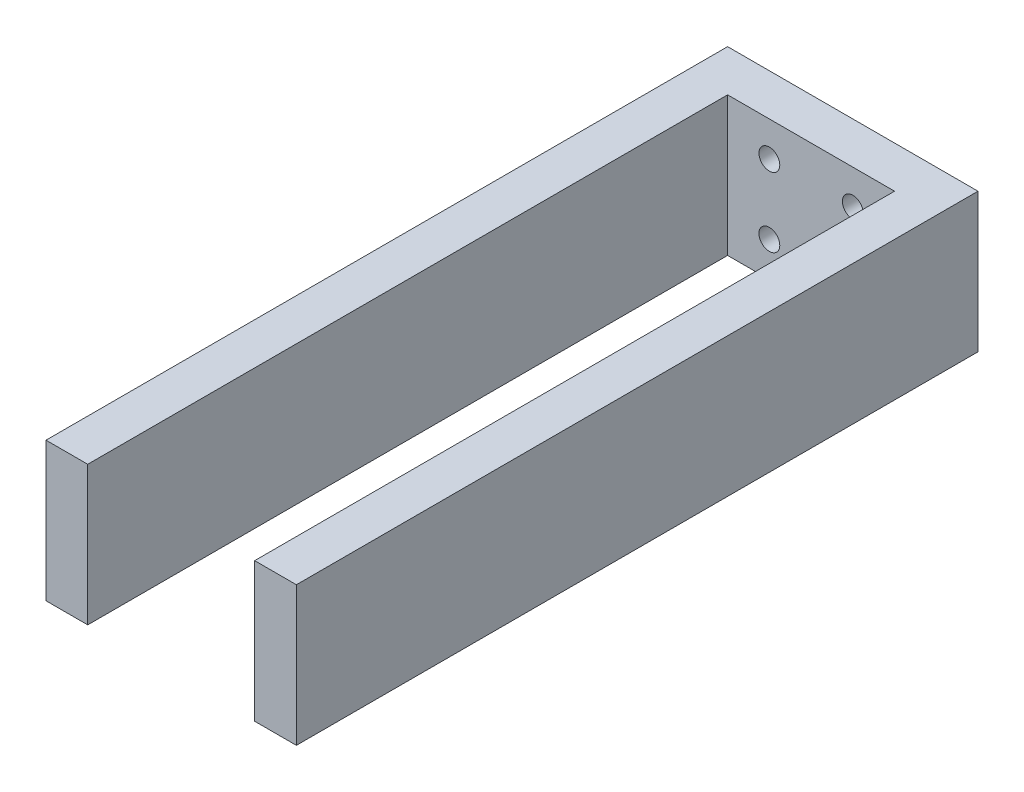
ISO-10303-21;
HEADER;
FILE_DESCRIPTION(('STEP AP214'),'2;1');
FILE_NAME('part.step','',(''),(''),'','','');
FILE_SCHEMA(('AUTOMOTIVE_DESIGN { 1 0 10303 214 1 1 1 1 }'));
ENDSEC;
DATA;
#1=APPLICATION_CONTEXT('core data for automotive mechanical design processes');
#2=APPLICATION_PROTOCOL_DEFINITION('international standard','automotive_design',2000,#1);
#3=PRODUCT_CONTEXT('',#1,'mechanical');
#4=PRODUCT('Part','Part','',(#3));
#5=PRODUCT_RELATED_PRODUCT_CATEGORY('part','',(#4));
#6=PRODUCT_DEFINITION_FORMATION('','',#4);
#7=PRODUCT_DEFINITION_CONTEXT('part definition',#1,'design');
#8=PRODUCT_DEFINITION('design','',#6,#7);
#9=PRODUCT_DEFINITION_SHAPE('','',#8);
#10=(LENGTH_UNIT() NAMED_UNIT(*) SI_UNIT(.MILLI.,.METRE.));
#11=(NAMED_UNIT(*) PLANE_ANGLE_UNIT() SI_UNIT($,.RADIAN.));
#12=(NAMED_UNIT(*) SI_UNIT($,.STERADIAN.) SOLID_ANGLE_UNIT());
#13=UNCERTAINTY_MEASURE_WITH_UNIT(LENGTH_MEASURE(1.E-05),#10,'distance_accuracy_value','');
#14=(GEOMETRIC_REPRESENTATION_CONTEXT(3) GLOBAL_UNCERTAINTY_ASSIGNED_CONTEXT((#13)) GLOBAL_UNIT_ASSIGNED_CONTEXT((#10,
#11,#12)) REPRESENTATION_CONTEXT('',''));
#15=CARTESIAN_POINT('',(0.,0.,0.));
#16=DIRECTION('',(0.,0.,1.));
#17=DIRECTION('',(1.,0.,0.));
#18=AXIS2_PLACEMENT_3D('',#15,#16,#17);
#19=CARTESIAN_POINT('',(0.,0.,6.));
#20=DIRECTION('',(0.,0.,1.));
#21=DIRECTION('',(1.,0.,0.));
#22=AXIS2_PLACEMENT_3D('',#19,#20,#21);
#23=PLANE('',#22);
#24=DIRECTION('',(0.,1.,0.));
#25=VECTOR('',#24,1.);
#26=CARTESIAN_POINT('',(-12.,0.,6.));
#27=LINE('',#26,#25);
#28=CARTESIAN_POINT('',(-12.,-10.,6.00000000000001));
#29=VERTEX_POINT('',#28);
#30=CARTESIAN_POINT('',(-12.,10.,6.));
#31=VERTEX_POINT('',#30);
#32=EDGE_CURVE('E110',#29,#31,#27,.T.);
#33=ORIENTED_EDGE('',*,*,#32,.F.);
#34=DIRECTION('',(1.,0.,0.));
#35=VECTOR('',#34,1.);
#36=CARTESIAN_POINT('',(0.,-10.,6.));
#37=LINE('',#36,#35);
#38=CARTESIAN_POINT('',(12.,-10.,6.));
#39=VERTEX_POINT('',#38);
#40=EDGE_CURVE('E169',#29,#39,#37,.T.);
#41=ORIENTED_EDGE('',*,*,#40,.T.);
#42=DIRECTION('',(0.,1.,0.));
#43=VECTOR('',#42,1.);
#44=CARTESIAN_POINT('',(12.,0.,6.));
#45=LINE('',#44,#43);
#46=CARTESIAN_POINT('',(12.,10.,6.));
#47=VERTEX_POINT('',#46);
#48=EDGE_CURVE('E165',#39,#47,#45,.T.);
#49=ORIENTED_EDGE('',*,*,#48,.T.);
#50=DIRECTION('',(1.,0.,0.));
#51=VECTOR('',#50,1.);
#52=CARTESIAN_POINT('',(0.,10.,6.));
#53=LINE('',#52,#51);
#54=EDGE_CURVE('E57',#31,#47,#53,.T.);
#55=ORIENTED_EDGE('',*,*,#54,.F.);
#56=EDGE_LOOP('',(#33,#41,#49,#55));
#57=FACE_BOUND('',#56,.T.);
#58=CARTESIAN_POINT('',(6.,-5.,6.));
#59=DIRECTION('',(0.,0.,1.));
#60=DIRECTION('',(1.,0.,0.));
#61=AXIS2_PLACEMENT_3D('',#58,#59,#60);
#62=CIRCLE('',#61,1.5);
#63=CARTESIAN_POINT('',(7.5,-5.,6.));
#64=VERTEX_POINT('',#63);
#65=EDGE_CURVE('E175',#64,#64,#62,.T.);
#66=ORIENTED_EDGE('',*,*,#65,.F.);
#67=EDGE_LOOP('',(#66));
#68=FACE_BOUND('',#67,.T.);
#69=CARTESIAN_POINT('',(-6.,-5.,6.));
#70=DIRECTION('',(0.,0.,1.));
#71=DIRECTION('',(1.,0.,0.));
#72=AXIS2_PLACEMENT_3D('',#69,#70,#71);
#73=CIRCLE('',#72,1.5);
#74=CARTESIAN_POINT('',(-4.5,-5.,6.));
#75=VERTEX_POINT('',#74);
#76=EDGE_CURVE('E179',#75,#75,#73,.T.);
#77=ORIENTED_EDGE('',*,*,#76,.F.);
#78=EDGE_LOOP('',(#77));
#79=FACE_BOUND('',#78,.T.);
#80=CARTESIAN_POINT('',(6.,5.,6.));
#81=DIRECTION('',(0.,0.,1.));
#82=DIRECTION('',(1.,0.,0.));
#83=AXIS2_PLACEMENT_3D('',#80,#81,#82);
#84=CIRCLE('',#83,1.5);
#85=CARTESIAN_POINT('',(7.5,5.,6.));
#86=VERTEX_POINT('',#85);
#87=EDGE_CURVE('E183',#86,#86,#84,.T.);
#88=ORIENTED_EDGE('',*,*,#87,.F.);
#89=EDGE_LOOP('',(#88));
#90=FACE_BOUND('',#89,.T.);
#91=CARTESIAN_POINT('',(-6.,5.,6.));
#92=DIRECTION('',(0.,0.,1.));
#93=DIRECTION('',(1.,0.,0.));
#94=AXIS2_PLACEMENT_3D('',#91,#92,#93);
#95=CIRCLE('',#94,1.5);
#96=CARTESIAN_POINT('',(-4.5,5.,6.));
#97=VERTEX_POINT('',#96);
#98=EDGE_CURVE('E187',#97,#97,#95,.T.);
#99=ORIENTED_EDGE('',*,*,#98,.F.);
#100=EDGE_LOOP('',(#99));
#101=FACE_BOUND('',#100,.T.);
#102=ADVANCED_FACE('F41',(#57,#68,#79,#90,#101),#23,.T.);
#103=CARTESIAN_POINT('',(0.,-10.,6.));
#104=DIRECTION('',(0.,1.,0.));
#105=DIRECTION('',(0.,0.,1.));
#106=AXIS2_PLACEMENT_3D('',#103,#104,#105);
#107=PLANE('',#106);
#108=ORIENTED_EDGE('',*,*,#40,.F.);
#109=DIRECTION('',(0.,0.,-1.));
#110=VECTOR('',#109,1.);
#111=CARTESIAN_POINT('',(-12.,-10.,98.));
#112=LINE('',#111,#110);
#113=CARTESIAN_POINT('',(-12.,-10.,98.));
#114=VERTEX_POINT('',#113);
#115=EDGE_CURVE('E113',#114,#29,#112,.T.);
#116=ORIENTED_EDGE('',*,*,#115,.F.);
#117=DIRECTION('',(1.,0.,0.));
#118=VECTOR('',#117,1.);
#119=CARTESIAN_POINT('',(0.,-10.,98.));
#120=LINE('',#119,#118);
#121=CARTESIAN_POINT('',(-18.,-10.,98.));
#122=VERTEX_POINT('',#121);
#123=EDGE_CURVE('E122',#122,#114,#120,.T.);
#124=ORIENTED_EDGE('',*,*,#123,.F.);
#125=DIRECTION('',(0.,0.,-1.));
#126=VECTOR('',#125,1.);
#127=CARTESIAN_POINT('',(-18.,-10.,6.));
#128=LINE('',#127,#126);
#129=CARTESIAN_POINT('',(-18.,-10.,0.));
#130=VERTEX_POINT('',#129);
#131=EDGE_CURVE('E191',#122,#130,#128,.T.);
#132=ORIENTED_EDGE('',*,*,#131,.T.);
#133=DIRECTION('',(1.,0.,0.));
#134=VECTOR('',#133,1.);
#135=CARTESIAN_POINT('',(0.,-10.,0.));
#136=LINE('',#135,#134);
#137=CARTESIAN_POINT('',(18.,-10.,0.));
#138=VERTEX_POINT('',#137);
#139=EDGE_CURVE('E168',#130,#138,#136,.T.);
#140=ORIENTED_EDGE('',*,*,#139,.T.);
#141=DIRECTION('',(0.,0.,-1.));
#142=VECTOR('',#141,1.);
#143=CARTESIAN_POINT('',(18.,-10.,6.));
#144=LINE('',#143,#142);
#145=CARTESIAN_POINT('',(18.,-10.,98.));
#146=VERTEX_POINT('',#145);
#147=EDGE_CURVE('E11',#146,#138,#144,.T.);
#148=ORIENTED_EDGE('',*,*,#147,.F.);
#149=DIRECTION('',(1.,0.,0.));
#150=VECTOR('',#149,1.);
#151=CARTESIAN_POINT('',(0.,-10.,98.));
#152=LINE('',#151,#150);
#153=CARTESIAN_POINT('',(12.,-10.,98.));
#154=VERTEX_POINT('',#153);
#155=EDGE_CURVE('E149',#154,#146,#152,.T.);
#156=ORIENTED_EDGE('',*,*,#155,.F.);
#157=DIRECTION('',(0.,0.,-1.));
#158=VECTOR('',#157,1.);
#159=CARTESIAN_POINT('',(12.,-10.,98.));
#160=LINE('',#159,#158);
#161=EDGE_CURVE('E157',#154,#39,#160,.T.);
#162=ORIENTED_EDGE('',*,*,#161,.T.);
#163=EDGE_LOOP('',(#108,#116,#124,#132,#140,#148,#156,#162));
#164=FACE_BOUND('',#163,.T.);
#165=ADVANCED_FACE('F43',(#164),#107,.F.);
#166=CARTESIAN_POINT('',(18.,0.,6.));
#167=DIRECTION('',(-1.,0.,0.));
#168=DIRECTION('',(0.,0.,1.));
#169=AXIS2_PLACEMENT_3D('',#166,#167,#168);
#170=PLANE('',#169);
#171=DIRECTION('',(0.,1.,0.));
#172=VECTOR('',#171,1.);
#173=CARTESIAN_POINT('',(18.,0.,0.));
#174=LINE('',#173,#172);
#175=CARTESIAN_POINT('',(18.,10.,0.));
#176=VERTEX_POINT('',#175);
#177=EDGE_CURVE('E194',#138,#176,#174,.T.);
#178=ORIENTED_EDGE('',*,*,#177,.T.);
#179=DIRECTION('',(0.,0.,-1.));
#180=VECTOR('',#179,1.);
#181=CARTESIAN_POINT('',(18.,10.,6.));
#182=LINE('',#181,#180);
#183=CARTESIAN_POINT('',(18.,10.,98.));
#184=VERTEX_POINT('',#183);
#185=EDGE_CURVE('E50',#184,#176,#182,.T.);
#186=ORIENTED_EDGE('',*,*,#185,.F.);
#187=DIRECTION('',(0.,1.,0.));
#188=VECTOR('',#187,1.);
#189=CARTESIAN_POINT('',(18.,0.,98.));
#190=LINE('',#189,#188);
#191=EDGE_CURVE('E153',#146,#184,#190,.T.);
#192=ORIENTED_EDGE('',*,*,#191,.F.);
#193=ORIENTED_EDGE('',*,*,#147,.T.);
#194=EDGE_LOOP('',(#178,#186,#192,#193));
#195=FACE_BOUND('',#194,.T.);
#196=ADVANCED_FACE('F228',(#195),#170,.F.);
#197=CARTESIAN_POINT('',(0.,10.,6.));
#198=DIRECTION('',(0.,1.,0.));
#199=DIRECTION('',(0.,0.,1.));
#200=AXIS2_PLACEMENT_3D('',#197,#198,#199);
#201=PLANE('',#200);
#202=ORIENTED_EDGE('',*,*,#185,.T.);
#203=DIRECTION('',(1.,0.,0.));
#204=VECTOR('',#203,1.);
#205=CARTESIAN_POINT('',(0.,10.,0.));
#206=LINE('',#205,#204);
#207=CARTESIAN_POINT('',(-18.,10.,0.));
#208=VERTEX_POINT('',#207);
#209=EDGE_CURVE('E198',#208,#176,#206,.T.);
#210=ORIENTED_EDGE('',*,*,#209,.F.);
#211=DIRECTION('',(0.,0.,-1.));
#212=VECTOR('',#211,1.);
#213=CARTESIAN_POINT('',(-18.,10.,6.));
#214=LINE('',#213,#212);
#215=CARTESIAN_POINT('',(-18.,10.,98.));
#216=VERTEX_POINT('',#215);
#217=EDGE_CURVE('E129',#216,#208,#214,.T.);
#218=ORIENTED_EDGE('',*,*,#217,.F.);
#219=DIRECTION('',(1.,0.,0.));
#220=VECTOR('',#219,1.);
#221=CARTESIAN_POINT('',(0.,10.,98.));
#222=LINE('',#221,#220);
#223=CARTESIAN_POINT('',(-12.,10.,98.));
#224=VERTEX_POINT('',#223);
#225=EDGE_CURVE('E119',#216,#224,#222,.T.);
#226=ORIENTED_EDGE('',*,*,#225,.T.);
#227=DIRECTION('',(0.,0.,-1.));
#228=VECTOR('',#227,1.);
#229=CARTESIAN_POINT('',(-12.,10.,98.));
#230=LINE('',#229,#228);
#231=EDGE_CURVE('E105',#224,#31,#230,.T.);
#232=ORIENTED_EDGE('',*,*,#231,.T.);
#233=ORIENTED_EDGE('',*,*,#54,.T.);
#234=DIRECTION('',(0.,0.,-1.));
#235=VECTOR('',#234,1.);
#236=CARTESIAN_POINT('',(12.,10.,98.));
#237=LINE('',#236,#235);
#238=CARTESIAN_POINT('',(12.,10.,98.));
#239=VERTEX_POINT('',#238);
#240=EDGE_CURVE('E161',#239,#47,#237,.T.);
#241=ORIENTED_EDGE('',*,*,#240,.F.);
#242=DIRECTION('',(1.,0.,0.));
#243=VECTOR('',#242,1.);
#244=CARTESIAN_POINT('',(0.,10.,98.));
#245=LINE('',#244,#243);
#246=EDGE_CURVE('E142',#239,#184,#245,.T.);
#247=ORIENTED_EDGE('',*,*,#246,.T.);
#248=EDGE_LOOP('',(#202,#210,#218,#226,#232,#233,#241,#247));
#249=FACE_BOUND('',#248,.T.);
#250=ADVANCED_FACE('F127',(#249),#201,.T.);
#251=CARTESIAN_POINT('',(6.,5.,6.));
#252=DIRECTION('',(0.,0.,-1.));
#253=DIRECTION('',(-1.,0.,0.));
#254=AXIS2_PLACEMENT_3D('',#251,#252,#253);
#255=CYLINDRICAL_SURFACE('',#254,1.5);
#256=ORIENTED_EDGE('',*,*,#87,.T.);
#257=EDGE_LOOP('',(#256));
#258=FACE_BOUND('',#257,.T.);
#259=CARTESIAN_POINT('',(6.,5.,0.));
#260=DIRECTION('',(0.,0.,1.));
#261=DIRECTION('',(1.,0.,0.));
#262=AXIS2_PLACEMENT_3D('',#259,#260,#261);
#263=CIRCLE('',#262,1.5);
#264=CARTESIAN_POINT('',(7.5,5.,0.));
#265=VERTEX_POINT('',#264);
#266=EDGE_CURVE('E213',#265,#265,#263,.T.);
#267=ORIENTED_EDGE('',*,*,#266,.F.);
#268=EDGE_LOOP('',(#267));
#269=FACE_BOUND('',#268,.T.);
#270=ADVANCED_FACE('F276',(#258,#269),#255,.F.);
#271=CARTESIAN_POINT('',(-6.,-5.,6.));
#272=DIRECTION('',(0.,0.,-1.));
#273=DIRECTION('',(-1.,0.,0.));
#274=AXIS2_PLACEMENT_3D('',#271,#272,#273);
#275=CYLINDRICAL_SURFACE('',#274,1.5);
#276=ORIENTED_EDGE('',*,*,#76,.T.);
#277=EDGE_LOOP('',(#276));
#278=FACE_BOUND('',#277,.T.);
#279=CARTESIAN_POINT('',(-6.,-5.,0.));
#280=DIRECTION('',(0.,0.,1.));
#281=DIRECTION('',(1.,0.,0.));
#282=AXIS2_PLACEMENT_3D('',#279,#280,#281);
#283=CIRCLE('',#282,1.5);
#284=CARTESIAN_POINT('',(-4.5,-5.,0.));
#285=VERTEX_POINT('',#284);
#286=EDGE_CURVE('E209',#285,#285,#283,.T.);
#287=ORIENTED_EDGE('',*,*,#286,.F.);
#288=EDGE_LOOP('',(#287));
#289=FACE_BOUND('',#288,.T.);
#290=ADVANCED_FACE('F268',(#278,#289),#275,.F.);
#291=CARTESIAN_POINT('',(6.,-5.,6.));
#292=DIRECTION('',(0.,0.,-1.));
#293=DIRECTION('',(-1.,0.,0.));
#294=AXIS2_PLACEMENT_3D('',#291,#292,#293);
#295=CYLINDRICAL_SURFACE('',#294,1.5);
#296=ORIENTED_EDGE('',*,*,#65,.T.);
#297=EDGE_LOOP('',(#296));
#298=FACE_BOUND('',#297,.T.);
#299=CARTESIAN_POINT('',(6.,-5.,0.));
#300=DIRECTION('',(0.,0.,1.));
#301=DIRECTION('',(1.,0.,0.));
#302=AXIS2_PLACEMENT_3D('',#299,#300,#301);
#303=CIRCLE('',#302,1.5);
#304=CARTESIAN_POINT('',(7.5,-5.,0.));
#305=VERTEX_POINT('',#304);
#306=EDGE_CURVE('E205',#305,#305,#303,.T.);
#307=ORIENTED_EDGE('',*,*,#306,.F.);
#308=EDGE_LOOP('',(#307));
#309=FACE_BOUND('',#308,.T.);
#310=ADVANCED_FACE('F266',(#298,#309),#295,.F.);
#311=CARTESIAN_POINT('',(-18.,0.,6.));
#312=DIRECTION('',(-1.,0.,0.));
#313=DIRECTION('',(0.,0.,1.));
#314=AXIS2_PLACEMENT_3D('',#311,#312,#313);
#315=PLANE('',#314);
#316=DIRECTION('',(0.,1.,0.));
#317=VECTOR('',#316,1.);
#318=CARTESIAN_POINT('',(-18.,0.,0.));
#319=LINE('',#318,#317);
#320=EDGE_CURVE('E201',#130,#208,#319,.T.);
#321=ORIENTED_EDGE('',*,*,#320,.F.);
#322=ORIENTED_EDGE('',*,*,#131,.F.);
#323=DIRECTION('',(0.,1.,0.));
#324=VECTOR('',#323,1.);
#325=CARTESIAN_POINT('',(-18.,0.,98.));
#326=LINE('',#325,#324);
#327=EDGE_CURVE('E131',#122,#216,#326,.T.);
#328=ORIENTED_EDGE('',*,*,#327,.T.);
#329=ORIENTED_EDGE('',*,*,#217,.T.);
#330=EDGE_LOOP('',(#321,#322,#328,#329));
#331=FACE_BOUND('',#330,.T.);
#332=ADVANCED_FACE('F235',(#331),#315,.T.);
#333=CARTESIAN_POINT('',(-6.,5.,6.));
#334=DIRECTION('',(0.,0.,-1.));
#335=DIRECTION('',(-1.,0.,0.));
#336=AXIS2_PLACEMENT_3D('',#333,#334,#335);
#337=CYLINDRICAL_SURFACE('',#336,1.5);
#338=ORIENTED_EDGE('',*,*,#98,.T.);
#339=EDGE_LOOP('',(#338));
#340=FACE_BOUND('',#339,.T.);
#341=CARTESIAN_POINT('',(-6.,5.,0.));
#342=DIRECTION('',(0.,0.,1.));
#343=DIRECTION('',(1.,0.,0.));
#344=AXIS2_PLACEMENT_3D('',#341,#342,#343);
#345=CIRCLE('',#344,1.5);
#346=CARTESIAN_POINT('',(-4.5,5.,0.));
#347=VERTEX_POINT('',#346);
#348=EDGE_CURVE('E172',#347,#347,#345,.T.);
#349=ORIENTED_EDGE('',*,*,#348,.F.);
#350=EDGE_LOOP('',(#349));
#351=FACE_BOUND('',#350,.T.);
#352=ADVANCED_FACE('F251',(#340,#351),#337,.F.);
#353=CARTESIAN_POINT('',(0.,0.,0.));
#354=DIRECTION('',(0.,0.,1.));
#355=DIRECTION('',(1.,0.,0.));
#356=AXIS2_PLACEMENT_3D('',#353,#354,#355);
#357=PLANE('',#356);
#358=ORIENTED_EDGE('',*,*,#177,.F.);
#359=ORIENTED_EDGE('',*,*,#139,.F.);
#360=ORIENTED_EDGE('',*,*,#320,.T.);
#361=ORIENTED_EDGE('',*,*,#209,.T.);
#362=EDGE_LOOP('',(#358,#359,#360,#361));
#363=FACE_BOUND('',#362,.T.);
#364=ORIENTED_EDGE('',*,*,#348,.T.);
#365=EDGE_LOOP('',(#364));
#366=FACE_BOUND('',#365,.T.);
#367=ORIENTED_EDGE('',*,*,#266,.T.);
#368=EDGE_LOOP('',(#367));
#369=FACE_BOUND('',#368,.T.);
#370=ORIENTED_EDGE('',*,*,#286,.T.);
#371=EDGE_LOOP('',(#370));
#372=FACE_BOUND('',#371,.T.);
#373=ORIENTED_EDGE('',*,*,#306,.T.);
#374=EDGE_LOOP('',(#373));
#375=FACE_BOUND('',#374,.T.);
#376=ADVANCED_FACE('F231',(#363,#366,#369,#372,#375),#357,.F.);
#377=CARTESIAN_POINT('',(12.,0.,98.));
#378=DIRECTION('',(1.,0.,0.));
#379=DIRECTION('',(0.,1.,0.));
#380=AXIS2_PLACEMENT_3D('',#377,#378,#379);
#381=PLANE('',#380);
#382=ORIENTED_EDGE('',*,*,#48,.F.);
#383=ORIENTED_EDGE('',*,*,#161,.F.);
#384=DIRECTION('',(0.,-1.,0.));
#385=VECTOR('',#384,1.);
#386=CARTESIAN_POINT('',(12.,0.,98.));
#387=LINE('',#386,#385);
#388=EDGE_CURVE('E146',#239,#154,#387,.T.);
#389=ORIENTED_EDGE('',*,*,#388,.F.);
#390=ORIENTED_EDGE('',*,*,#240,.T.);
#391=EDGE_LOOP('',(#382,#383,#389,#390));
#392=FACE_BOUND('',#391,.T.);
#393=ADVANCED_FACE('F258',(#392),#381,.F.);
#394=CARTESIAN_POINT('',(0.,0.,98.));
#395=DIRECTION('',(0.,0.,1.));
#396=DIRECTION('',(1.,0.,0.));
#397=AXIS2_PLACEMENT_3D('',#394,#395,#396);
#398=PLANE('',#397);
#399=ORIENTED_EDGE('',*,*,#246,.F.);
#400=ORIENTED_EDGE('',*,*,#388,.T.);
#401=ORIENTED_EDGE('',*,*,#155,.T.);
#402=ORIENTED_EDGE('',*,*,#191,.T.);
#403=EDGE_LOOP('',(#399,#400,#401,#402));
#404=FACE_BOUND('',#403,.T.);
#405=ADVANCED_FACE('F355',(#404),#398,.T.);
#406=CARTESIAN_POINT('',(-12.,0.,98.));
#407=DIRECTION('',(1.,0.,0.));
#408=DIRECTION('',(0.,1.,0.));
#409=AXIS2_PLACEMENT_3D('',#406,#407,#408);
#410=PLANE('',#409);
#411=ORIENTED_EDGE('',*,*,#115,.T.);
#412=ORIENTED_EDGE('',*,*,#32,.T.);
#413=ORIENTED_EDGE('',*,*,#231,.F.);
#414=DIRECTION('',(0.,-1.,0.));
#415=VECTOR('',#414,1.);
#416=CARTESIAN_POINT('',(-12.,0.,98.));
#417=LINE('',#416,#415);
#418=EDGE_CURVE('E109',#224,#114,#417,.T.);
#419=ORIENTED_EDGE('',*,*,#418,.T.);
#420=EDGE_LOOP('',(#411,#412,#413,#419));
#421=FACE_BOUND('',#420,.T.);
#422=ADVANCED_FACE('F108',(#421),#410,.T.);
#423=CARTESIAN_POINT('',(0.,0.,98.));
#424=DIRECTION('',(0.,0.,1.));
#425=DIRECTION('',(1.,0.,0.));
#426=AXIS2_PLACEMENT_3D('',#423,#424,#425);
#427=PLANE('',#426);
#428=ORIENTED_EDGE('',*,*,#418,.F.);
#429=ORIENTED_EDGE('',*,*,#225,.F.);
#430=ORIENTED_EDGE('',*,*,#327,.F.);
#431=ORIENTED_EDGE('',*,*,#123,.T.);
#432=EDGE_LOOP('',(#428,#429,#430,#431));
#433=FACE_BOUND('',#432,.T.);
#434=ADVANCED_FACE('F117',(#433),#427,.T.);
#435=CLOSED_SHELL('',(#102,#165,#196,#250,#270,#290,#310,#332,#352,#376,#393,#405,#422,#434));
#436=MANIFOLD_SOLID_BREP('B2',#435);
#437=ADVANCED_BREP_SHAPE_REPRESENTATION('',(#18,#436),#14);
#438=SHAPE_DEFINITION_REPRESENTATION(#9,#437);
ENDSEC;
END-ISO-10303-21;
